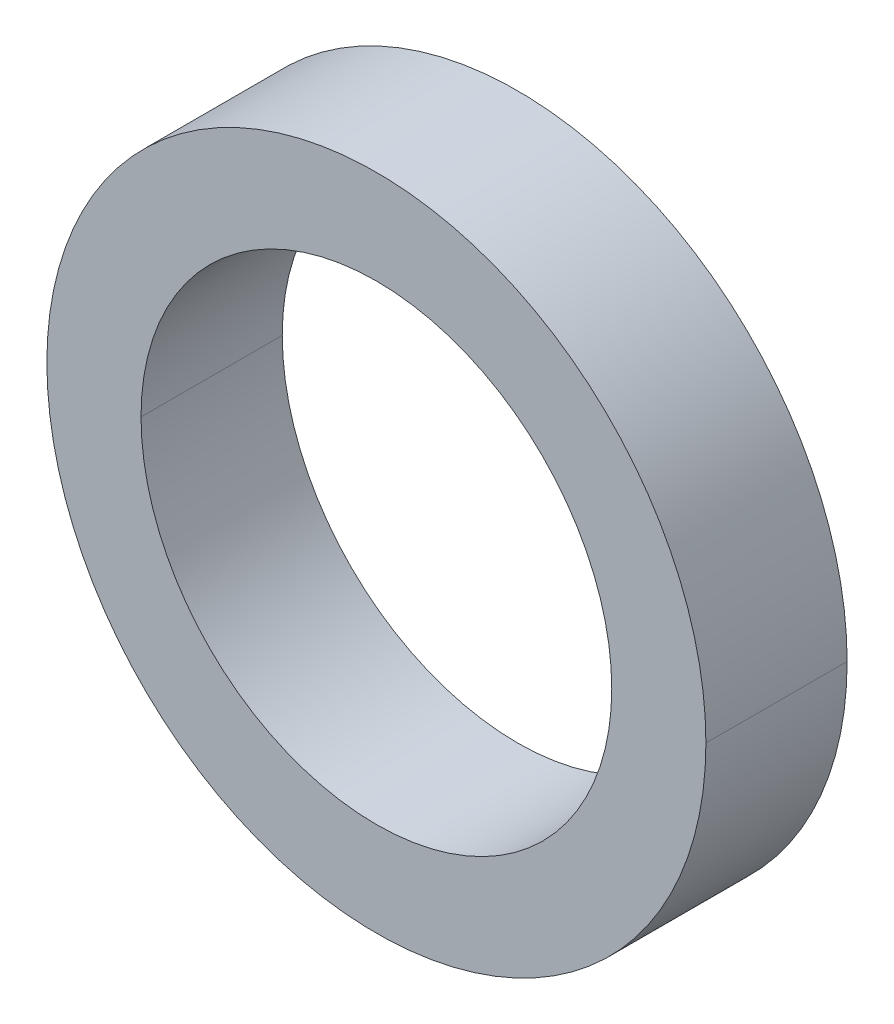
ISO-10303-21;
HEADER;
FILE_DESCRIPTION(('STEP AP214'),'2;1');
FILE_NAME('part.step','',(''),(''),'','','');
FILE_SCHEMA(('AUTOMOTIVE_DESIGN { 1 0 10303 214 1 1 1 1 }'));
ENDSEC;
DATA;
#1=APPLICATION_CONTEXT('core data for automotive mechanical design processes');
#2=APPLICATION_PROTOCOL_DEFINITION('international standard','automotive_design',2000,#1);
#3=PRODUCT_CONTEXT('',#1,'mechanical');
#4=PRODUCT('Part','Part','',(#3));
#5=PRODUCT_RELATED_PRODUCT_CATEGORY('part','',(#4));
#6=PRODUCT_DEFINITION_FORMATION('','',#4);
#7=PRODUCT_DEFINITION_CONTEXT('part definition',#1,'design');
#8=PRODUCT_DEFINITION('design','',#6,#7);
#9=PRODUCT_DEFINITION_SHAPE('','',#8);
#10=(LENGTH_UNIT() NAMED_UNIT(*) SI_UNIT(.MILLI.,.METRE.));
#11=(NAMED_UNIT(*) PLANE_ANGLE_UNIT() SI_UNIT($,.RADIAN.));
#12=(NAMED_UNIT(*) SI_UNIT($,.STERADIAN.) SOLID_ANGLE_UNIT());
#13=UNCERTAINTY_MEASURE_WITH_UNIT(LENGTH_MEASURE(1.E-05),#10,'distance_accuracy_value','');
#14=(GEOMETRIC_REPRESENTATION_CONTEXT(3) GLOBAL_UNCERTAINTY_ASSIGNED_CONTEXT((#13)) GLOBAL_UNIT_ASSIGNED_CONTEXT((#10,
#11,#12)) REPRESENTATION_CONTEXT('',''));
#15=CARTESIAN_POINT('',(0.,0.,0.));
#16=DIRECTION('',(0.,0.,1.));
#17=DIRECTION('',(1.,0.,0.));
#18=AXIS2_PLACEMENT_3D('',#15,#16,#17);
#19=CARTESIAN_POINT('',(0.,0.,1.5));
#20=DIRECTION('',(0.,0.,-1.));
#21=DIRECTION('',(0.,1.,0.));
#22=AXIS2_PLACEMENT_3D('',#19,#20,#21);
#23=CYLINDRICAL_SURFACE('',#22,7.);
#24=DIRECTION('',(0.,0.,-1.));
#25=VECTOR('',#24,1.);
#26=CARTESIAN_POINT('',(7.,0.,1.5));
#27=LINE('',#26,#25);
#28=CARTESIAN_POINT('',(7.,0.,1.5));
#29=VERTEX_POINT('',#28);
#30=CARTESIAN_POINT('',(7.,0.,-1.5));
#31=VERTEX_POINT('',#30);
#32=EDGE_CURVE('E11',#29,#31,#27,.T.);
#33=ORIENTED_EDGE('',*,*,#32,.F.);
#34=CARTESIAN_POINT('',(0.,0.,1.5));
#35=DIRECTION('',(0.,0.,1.));
#36=DIRECTION('',(1.,0.,0.));
#37=AXIS2_PLACEMENT_3D('',#34,#35,#36);
#38=CIRCLE('',#37,7.);
#39=CARTESIAN_POINT('',(-7.,0.,1.5));
#40=VERTEX_POINT('',#39);
#41=EDGE_CURVE('E25',#40,#29,#38,.T.);
#42=ORIENTED_EDGE('',*,*,#41,.F.);
#43=DIRECTION('',(0.,0.,-1.));
#44=VECTOR('',#43,1.);
#45=CARTESIAN_POINT('',(-7.,0.,1.5));
#46=LINE('',#45,#44);
#47=CARTESIAN_POINT('',(-7.,0.,-1.5));
#48=VERTEX_POINT('',#47);
#49=EDGE_CURVE('E98',#40,#48,#46,.T.);
#50=ORIENTED_EDGE('',*,*,#49,.T.);
#51=CARTESIAN_POINT('',(0.,0.,-1.5));
#52=DIRECTION('',(0.,0.,1.));
#53=DIRECTION('',(1.,0.,0.));
#54=AXIS2_PLACEMENT_3D('',#51,#52,#53);
#55=CIRCLE('',#54,7.);
#56=EDGE_CURVE('E94',#48,#31,#55,.T.);
#57=ORIENTED_EDGE('',*,*,#56,.T.);
#58=EDGE_LOOP('',(#33,#42,#50,#57));
#59=FACE_BOUND('',#58,.T.);
#60=ADVANCED_FACE('F17',(#59),#23,.T.);
#61=CARTESIAN_POINT('',(0.,0.,-1.5));
#62=DIRECTION('',(0.,0.,1.));
#63=DIRECTION('',(1.,0.,0.));
#64=AXIS2_PLACEMENT_3D('',#61,#62,#63);
#65=PLANE('',#64);
#66=CARTESIAN_POINT('',(0.,0.,-1.5));
#67=DIRECTION('',(0.,0.,1.));
#68=DIRECTION('',(1.,0.,0.));
#69=AXIS2_PLACEMENT_3D('',#66,#67,#68);
#70=CIRCLE('',#69,5.);
#71=CARTESIAN_POINT('',(5.,0.,-1.5));
#72=VERTEX_POINT('',#71);
#73=CARTESIAN_POINT('',(-5.,0.,-1.5));
#74=VERTEX_POINT('',#73);
#75=EDGE_CURVE('E67',#72,#74,#70,.T.);
#76=ORIENTED_EDGE('',*,*,#75,.T.);
#77=CARTESIAN_POINT('',(0.,0.,-1.5));
#78=DIRECTION('',(0.,0.,1.));
#79=DIRECTION('',(1.,0.,0.));
#80=AXIS2_PLACEMENT_3D('',#77,#78,#79);
#81=CIRCLE('',#80,5.);
#82=EDGE_CURVE('E87',#74,#72,#81,.T.);
#83=ORIENTED_EDGE('',*,*,#82,.T.);
#84=EDGE_LOOP('',(#76,#83));
#85=FACE_BOUND('',#84,.T.);
#86=ORIENTED_EDGE('',*,*,#56,.F.);
#87=CARTESIAN_POINT('',(0.,0.,-1.5));
#88=DIRECTION('',(0.,0.,1.));
#89=DIRECTION('',(1.,0.,0.));
#90=AXIS2_PLACEMENT_3D('',#87,#88,#89);
#91=CIRCLE('',#90,7.);
#92=EDGE_CURVE('E76',#31,#48,#91,.T.);
#93=ORIENTED_EDGE('',*,*,#92,.F.);
#94=EDGE_LOOP('',(#86,#93));
#95=FACE_BOUND('',#94,.T.);
#96=ADVANCED_FACE('F111',(#85,#95),#65,.F.);
#97=CARTESIAN_POINT('',(0.,0.,1.5));
#98=DIRECTION('',(0.,0.,-1.));
#99=DIRECTION('',(0.,-1.,0.));
#100=AXIS2_PLACEMENT_3D('',#97,#98,#99);
#101=CYLINDRICAL_SURFACE('',#100,7.);
#102=ORIENTED_EDGE('',*,*,#32,.T.);
#103=ORIENTED_EDGE('',*,*,#92,.T.);
#104=ORIENTED_EDGE('',*,*,#49,.F.);
#105=CARTESIAN_POINT('',(0.,0.,1.5));
#106=DIRECTION('',(0.,0.,1.));
#107=DIRECTION('',(1.,0.,0.));
#108=AXIS2_PLACEMENT_3D('',#105,#106,#107);
#109=CIRCLE('',#108,7.);
#110=EDGE_CURVE('E73',#29,#40,#109,.T.);
#111=ORIENTED_EDGE('',*,*,#110,.F.);
#112=EDGE_LOOP('',(#102,#103,#104,#111));
#113=FACE_BOUND('',#112,.T.);
#114=ADVANCED_FACE('F107',(#113),#101,.T.);
#115=CARTESIAN_POINT('',(0.,0.,1.5));
#116=DIRECTION('',(0.,0.,1.));
#117=DIRECTION('',(1.,0.,0.));
#118=AXIS2_PLACEMENT_3D('',#115,#116,#117);
#119=PLANE('',#118);
#120=CARTESIAN_POINT('',(0.,0.,1.5));
#121=DIRECTION('',(0.,0.,1.));
#122=DIRECTION('',(1.,0.,0.));
#123=AXIS2_PLACEMENT_3D('',#120,#121,#122);
#124=CIRCLE('',#123,5.);
#125=CARTESIAN_POINT('',(-5.,0.,1.5));
#126=VERTEX_POINT('',#125);
#127=CARTESIAN_POINT('',(5.,0.,1.5));
#128=VERTEX_POINT('',#127);
#129=EDGE_CURVE('E58',#126,#128,#124,.T.);
#130=ORIENTED_EDGE('',*,*,#129,.F.);
#131=CARTESIAN_POINT('',(0.,0.,1.5));
#132=DIRECTION('',(0.,0.,1.));
#133=DIRECTION('',(1.,0.,0.));
#134=AXIS2_PLACEMENT_3D('',#131,#132,#133);
#135=CIRCLE('',#134,5.);
#136=EDGE_CURVE('E53',#128,#126,#135,.T.);
#137=ORIENTED_EDGE('',*,*,#136,.F.);
#138=EDGE_LOOP('',(#130,#137));
#139=FACE_BOUND('',#138,.T.);
#140=ORIENTED_EDGE('',*,*,#110,.T.);
#141=ORIENTED_EDGE('',*,*,#41,.T.);
#142=EDGE_LOOP('',(#140,#141));
#143=FACE_BOUND('',#142,.T.);
#144=ADVANCED_FACE('F55',(#139,#143),#119,.T.);
#145=CARTESIAN_POINT('',(0.,0.,1.5));
#146=DIRECTION('',(0.,0.,-1.));
#147=DIRECTION('',(0.,-1.,0.));
#148=AXIS2_PLACEMENT_3D('',#145,#146,#147);
#149=CYLINDRICAL_SURFACE('',#148,5.);
#150=DIRECTION('',(0.,0.,-1.));
#151=VECTOR('',#150,1.);
#152=CARTESIAN_POINT('',(5.,0.,1.5));
#153=LINE('',#152,#151);
#154=EDGE_CURVE('E62',#128,#72,#153,.T.);
#155=ORIENTED_EDGE('',*,*,#154,.F.);
#156=ORIENTED_EDGE('',*,*,#136,.T.);
#157=DIRECTION('',(0.,0.,-1.));
#158=VECTOR('',#157,1.);
#159=CARTESIAN_POINT('',(-5.,0.,1.5));
#160=LINE('',#159,#158);
#161=EDGE_CURVE('E70',#126,#74,#160,.T.);
#162=ORIENTED_EDGE('',*,*,#161,.T.);
#163=ORIENTED_EDGE('',*,*,#75,.F.);
#164=EDGE_LOOP('',(#155,#156,#162,#163));
#165=FACE_BOUND('',#164,.T.);
#166=ADVANCED_FACE('F66',(#165),#149,.F.);
#167=CARTESIAN_POINT('',(0.,0.,1.5));
#168=DIRECTION('',(0.,0.,-1.));
#169=DIRECTION('',(0.,1.,0.));
#170=AXIS2_PLACEMENT_3D('',#167,#168,#169);
#171=CYLINDRICAL_SURFACE('',#170,5.);
#172=ORIENTED_EDGE('',*,*,#154,.T.);
#173=ORIENTED_EDGE('',*,*,#82,.F.);
#174=ORIENTED_EDGE('',*,*,#161,.F.);
#175=ORIENTED_EDGE('',*,*,#129,.T.);
#176=EDGE_LOOP('',(#172,#173,#174,#175));
#177=FACE_BOUND('',#176,.T.);
#178=ADVANCED_FACE('F72',(#177),#171,.F.);
#179=CLOSED_SHELL('',(#60,#96,#114,#144,#166,#178));
#180=MANIFOLD_SOLID_BREP('B1',#179);
#181=ADVANCED_BREP_SHAPE_REPRESENTATION('',(#18,#180),#14);
#182=SHAPE_DEFINITION_REPRESENTATION(#9,#181);
ENDSEC;
END-ISO-10303-21;
